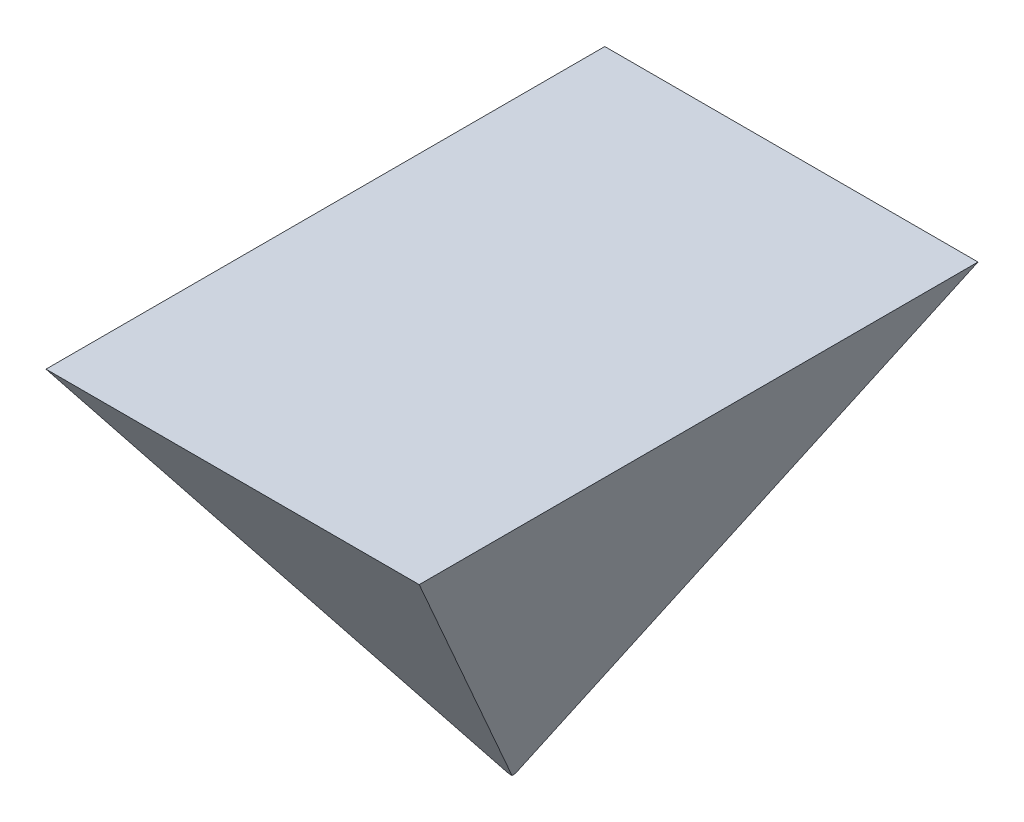
ISO-10303-21;
HEADER;
FILE_DESCRIPTION(('STEP AP214'),'2;1');
FILE_NAME('part.step','',(''),(''),'','','');
FILE_SCHEMA(('AUTOMOTIVE_DESIGN { 1 0 10303 214 1 1 1 1 }'));
ENDSEC;
DATA;
#1=APPLICATION_CONTEXT('core data for automotive mechanical design processes');
#2=APPLICATION_PROTOCOL_DEFINITION('international standard','automotive_design',2000,#1);
#3=PRODUCT_CONTEXT('',#1,'mechanical');
#4=PRODUCT('Part','Part','',(#3));
#5=PRODUCT_RELATED_PRODUCT_CATEGORY('part','',(#4));
#6=PRODUCT_DEFINITION_FORMATION('','',#4);
#7=PRODUCT_DEFINITION_CONTEXT('part definition',#1,'design');
#8=PRODUCT_DEFINITION('design','',#6,#7);
#9=PRODUCT_DEFINITION_SHAPE('','',#8);
#10=(LENGTH_UNIT() NAMED_UNIT(*) SI_UNIT(.MILLI.,.METRE.));
#11=(NAMED_UNIT(*) PLANE_ANGLE_UNIT() SI_UNIT($,.RADIAN.));
#12=(NAMED_UNIT(*) SI_UNIT($,.STERADIAN.) SOLID_ANGLE_UNIT());
#13=UNCERTAINTY_MEASURE_WITH_UNIT(LENGTH_MEASURE(1.E-05),#10,'distance_accuracy_value','');
#14=(GEOMETRIC_REPRESENTATION_CONTEXT(3) GLOBAL_UNCERTAINTY_ASSIGNED_CONTEXT((#13)) GLOBAL_UNIT_ASSIGNED_CONTEXT((#10,
#11,#12)) REPRESENTATION_CONTEXT('',''));
#15=CARTESIAN_POINT('',(0.,0.,0.));
#16=DIRECTION('',(0.,0.,1.));
#17=DIRECTION('',(1.,0.,0.));
#18=AXIS2_PLACEMENT_3D('',#15,#16,#17);
#19=CARTESIAN_POINT('',(-2.5,0.,-2.5));
#20=DIRECTION('',(0.,-0.573576436351047,-0.819152044288991));
#21=DIRECTION('',(0.,0.819152044288991,-0.573576436351047));
#22=AXIS2_PLACEMENT_3D('',#19,#20,#21);
#23=PLANE('',#22);
#24=DIRECTION('',(-1.,0.,0.));
#25=VECTOR('',#24,1.);
#26=CARTESIAN_POINT('',(-2.5,0.,-2.5));
#27=LINE('',#26,#25);
#28=CARTESIAN_POINT('',(2.5,0.,-2.50000000000011));
#29=VERTEX_POINT('',#28);
#30=CARTESIAN_POINT('',(-2.5,0.,-2.5));
#31=VERTEX_POINT('',#30);
#32=EDGE_CURVE('E102',#29,#31,#27,.T.);
#33=ORIENTED_EDGE('',*,*,#32,.T.);
#34=DIRECTION('',(0.356830943299981,-0.765226427358759,0.53581731287389));
#35=VECTOR('',#34,1.);
#36=CARTESIAN_POINT('',(-2.5,0.,-2.5));
#37=LINE('',#36,#35);
#38=CARTESIAN_POINT('',(-282.284594893,600.,-422.624522925827));
#39=VERTEX_POINT('',#38);
#40=EDGE_CURVE('E57',#31,#39,#37,.F.);
#41=ORIENTED_EDGE('',*,*,#40,.T.);
#42=DIRECTION('',(1.,0.,0.));
#43=VECTOR('',#42,1.);
#44=CARTESIAN_POINT('',(0.,600.,-422.624522925827));
#45=LINE('',#44,#43);
#46=CARTESIAN_POINT('',(282.284594893,600.,-422.624522925827));
#47=VERTEX_POINT('',#46);
#48=EDGE_CURVE('E42',#47,#39,#45,.F.);
#49=ORIENTED_EDGE('',*,*,#48,.F.);
#50=DIRECTION('',(0.356830943299981,0.765226427358759,-0.53581731287389));
#51=VECTOR('',#50,1.);
#52=CARTESIAN_POINT('',(1.86335838951823,-1.3652823395625,-1.54401901405375));
#53=LINE('',#52,#51);
#54=EDGE_CURVE('E82',#47,#29,#53,.F.);
#55=ORIENTED_EDGE('',*,*,#54,.T.);
#56=EDGE_LOOP('',(#33,#41,#49,#55));
#57=FACE_BOUND('',#56,.T.);
#58=ADVANCED_FACE('F35',(#57),#23,.T.);
#59=CARTESIAN_POINT('',(-2.5,0.,2.5));
#60=DIRECTION('',(0.,-0.573576436351047,0.819152044288991));
#61=DIRECTION('',(0.,-0.819152044288991,-0.573576436351047));
#62=AXIS2_PLACEMENT_3D('',#59,#60,#61);
#63=PLANE('',#62);
#64=DIRECTION('',(-1.,0.,0.));
#65=VECTOR('',#64,1.);
#66=CARTESIAN_POINT('',(0.,600.,422.624522925827));
#67=LINE('',#66,#65);
#68=CARTESIAN_POINT('',(-282.284594893,600.,422.624522925827));
#69=VERTEX_POINT('',#68);
#70=CARTESIAN_POINT('',(282.284594893,600.,422.624522925827));
#71=VERTEX_POINT('',#70);
#72=EDGE_CURVE('E11',#69,#71,#67,.F.);
#73=ORIENTED_EDGE('',*,*,#72,.F.);
#74=DIRECTION('',(-0.356830943299981,0.765226427358759,0.53581731287389));
#75=VECTOR('',#74,1.);
#76=CARTESIAN_POINT('',(-2.5,0.,2.5));
#77=LINE('',#76,#75);
#78=CARTESIAN_POINT('',(-2.5,0.,2.49999999999989));
#79=VERTEX_POINT('',#78);
#80=EDGE_CURVE('E73',#69,#79,#77,.F.);
#81=ORIENTED_EDGE('',*,*,#80,.T.);
#82=DIRECTION('',(1.,0.,0.));
#83=VECTOR('',#82,1.);
#84=CARTESIAN_POINT('',(-2.5,0.,2.5));
#85=LINE('',#84,#83);
#86=CARTESIAN_POINT('',(2.5,0.,2.5));
#87=VERTEX_POINT('',#86);
#88=EDGE_CURVE('E92',#79,#87,#85,.T.);
#89=ORIENTED_EDGE('',*,*,#88,.T.);
#90=DIRECTION('',(-0.356830943299981,-0.765226427358759,-0.53581731287389));
#91=VECTOR('',#90,1.);
#92=CARTESIAN_POINT('',(1.86335838951823,-1.3652823395625,1.54401901405374));
#93=LINE('',#92,#91);
#94=EDGE_CURVE('E49',#87,#71,#93,.F.);
#95=ORIENTED_EDGE('',*,*,#94,.T.);
#96=EDGE_LOOP('',(#73,#81,#89,#95));
#97=FACE_BOUND('',#96,.T.);
#98=ADVANCED_FACE('F91',(#97),#63,.T.);
#99=CARTESIAN_POINT('',(0.,600.,0.));
#100=DIRECTION('',(0.,-1.,0.));
#101=DIRECTION('',(0.,0.,-1.));
#102=AXIS2_PLACEMENT_3D('',#99,#100,#101);
#103=PLANE('',#102);
#104=ORIENTED_EDGE('',*,*,#48,.T.);
#105=DIRECTION('',(0.,0.,1.));
#106=VECTOR('',#105,1.);
#107=CARTESIAN_POINT('',(-282.284594893,600.,-422.624522925827));
#108=LINE('',#107,#106);
#109=EDGE_CURVE('E76',#39,#69,#108,.T.);
#110=ORIENTED_EDGE('',*,*,#109,.T.);
#111=ORIENTED_EDGE('',*,*,#72,.T.);
#112=DIRECTION('',(0.,0.,1.));
#113=VECTOR('',#112,1.);
#114=CARTESIAN_POINT('',(282.284594893,600.,-422.624522925827));
#115=LINE('',#114,#113);
#116=EDGE_CURVE('E89',#47,#71,#115,.T.);
#117=ORIENTED_EDGE('',*,*,#116,.F.);
#118=EDGE_LOOP('',(#104,#110,#111,#117));
#119=FACE_BOUND('',#118,.T.);
#120=ADVANCED_FACE('F86',(#119),#103,.F.);
#121=CARTESIAN_POINT('',(0.,0.,0.));
#122=DIRECTION('',(0.,-1.,0.));
#123=DIRECTION('',(0.,0.,-1.));
#124=AXIS2_PLACEMENT_3D('',#121,#122,#123);
#125=PLANE('',#124);
#126=DIRECTION('',(0.,0.,-1.));
#127=VECTOR('',#126,1.);
#128=CARTESIAN_POINT('',(2.5,0.,2.5));
#129=LINE('',#128,#127);
#130=EDGE_CURVE('E100',#87,#29,#129,.T.);
#131=ORIENTED_EDGE('',*,*,#130,.F.);
#132=ORIENTED_EDGE('',*,*,#88,.F.);
#133=DIRECTION('',(0.,0.,1.));
#134=VECTOR('',#133,1.);
#135=CARTESIAN_POINT('',(-2.5,0.,2.5));
#136=LINE('',#135,#134);
#137=EDGE_CURVE('E78',#31,#79,#136,.T.);
#138=ORIENTED_EDGE('',*,*,#137,.F.);
#139=ORIENTED_EDGE('',*,*,#32,.F.);
#140=EDGE_LOOP('',(#131,#132,#138,#139));
#141=FACE_BOUND('',#140,.T.);
#142=ADVANCED_FACE('F108',(#141),#125,.T.);
#143=CARTESIAN_POINT('',(2.5,0.,-422.624522925827));
#144=DIRECTION('',(-0.906307787036649,0.422618261740701,0.));
#145=DIRECTION('',(-0.422618261740701,-0.906307787036649,0.));
#146=AXIS2_PLACEMENT_3D('',#143,#144,#145);
#147=PLANE('',#146);
#148=ORIENTED_EDGE('',*,*,#116,.T.);
#149=ORIENTED_EDGE('',*,*,#94,.F.);
#150=ORIENTED_EDGE('',*,*,#130,.T.);
#151=ORIENTED_EDGE('',*,*,#54,.F.);
#152=EDGE_LOOP('',(#148,#149,#150,#151));
#153=FACE_BOUND('',#152,.T.);
#154=ADVANCED_FACE('F109',(#153),#147,.F.);
#155=CARTESIAN_POINT('',(-2.5,0.,-422.624522925827));
#156=DIRECTION('',(0.906307787036649,0.422618261740701,0.));
#157=DIRECTION('',(-0.422618261740701,0.906307787036649,0.));
#158=AXIS2_PLACEMENT_3D('',#155,#156,#157);
#159=PLANE('',#158);
#160=ORIENTED_EDGE('',*,*,#137,.T.);
#161=ORIENTED_EDGE('',*,*,#80,.F.);
#162=ORIENTED_EDGE('',*,*,#109,.F.);
#163=ORIENTED_EDGE('',*,*,#40,.F.);
#164=EDGE_LOOP('',(#160,#161,#162,#163));
#165=FACE_BOUND('',#164,.T.);
#166=ADVANCED_FACE('F75',(#165),#159,.F.);
#167=CLOSED_SHELL('',(#58,#98,#120,#142,#154,#166));
#168=MANIFOLD_SOLID_BREP('B2',#167);
#169=ADVANCED_BREP_SHAPE_REPRESENTATION('',(#18,#168),#14);
#170=SHAPE_DEFINITION_REPRESENTATION(#9,#169);
ENDSEC;
END-ISO-10303-21;
